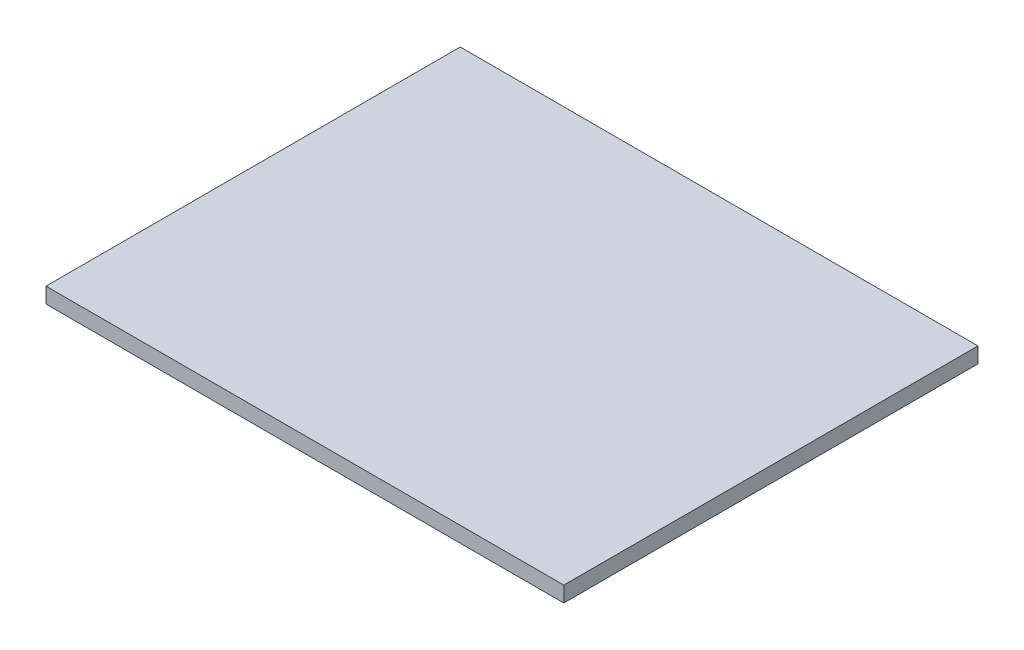
ISO-10303-21;
HEADER;
FILE_DESCRIPTION(('STEP AP214'),'2;1');
FILE_NAME('part.step','',(''),(''),'','','');
FILE_SCHEMA(('AUTOMOTIVE_DESIGN { 1 0 10303 214 1 1 1 1 }'));
ENDSEC;
DATA;
#1=APPLICATION_CONTEXT('core data for automotive mechanical design processes');
#2=APPLICATION_PROTOCOL_DEFINITION('international standard','automotive_design',2000,#1);
#3=PRODUCT_CONTEXT('',#1,'mechanical');
#4=PRODUCT('Part','Part','',(#3));
#5=PRODUCT_RELATED_PRODUCT_CATEGORY('part','',(#4));
#6=PRODUCT_DEFINITION_FORMATION('','',#4);
#7=PRODUCT_DEFINITION_CONTEXT('part definition',#1,'design');
#8=PRODUCT_DEFINITION('design','',#6,#7);
#9=PRODUCT_DEFINITION_SHAPE('','',#8);
#10=(LENGTH_UNIT() NAMED_UNIT(*) SI_UNIT(.MILLI.,.METRE.));
#11=(NAMED_UNIT(*) PLANE_ANGLE_UNIT() SI_UNIT($,.RADIAN.));
#12=(NAMED_UNIT(*) SI_UNIT($,.STERADIAN.) SOLID_ANGLE_UNIT());
#13=UNCERTAINTY_MEASURE_WITH_UNIT(LENGTH_MEASURE(1.E-05),#10,'distance_accuracy_value','');
#14=(GEOMETRIC_REPRESENTATION_CONTEXT(3) GLOBAL_UNCERTAINTY_ASSIGNED_CONTEXT((#13)) GLOBAL_UNIT_ASSIGNED_CONTEXT((#10,
#11,#12)) REPRESENTATION_CONTEXT('',''));
#15=CARTESIAN_POINT('',(0.,0.,0.));
#16=DIRECTION('',(0.,0.,1.));
#17=DIRECTION('',(1.,0.,0.));
#18=AXIS2_PLACEMENT_3D('',#15,#16,#17);
#19=CARTESIAN_POINT('',(0.,3.,0.));
#20=DIRECTION('',(1.,0.,0.));
#21=DIRECTION('',(0.,0.,-1.));
#22=AXIS2_PLACEMENT_3D('',#19,#20,#21);
#23=PLANE('',#22);
#24=DIRECTION('',(0.,0.,1.));
#25=VECTOR('',#24,1.);
#26=CARTESIAN_POINT('',(0.,0.,0.));
#27=LINE('',#26,#25);
#28=CARTESIAN_POINT('',(0.,0.,-80.));
#29=VERTEX_POINT('',#28);
#30=CARTESIAN_POINT('',(0.,0.,0.));
#31=VERTEX_POINT('',#30);
#32=EDGE_CURVE('E97',#29,#31,#27,.T.);
#33=ORIENTED_EDGE('',*,*,#32,.T.);
#34=DIRECTION('',(0.,-1.,0.));
#35=VECTOR('',#34,1.);
#36=CARTESIAN_POINT('',(0.,3.,0.));
#37=LINE('',#36,#35);
#38=CARTESIAN_POINT('',(0.,3.,0.));
#39=VERTEX_POINT('',#38);
#40=EDGE_CURVE('E11',#39,#31,#37,.T.);
#41=ORIENTED_EDGE('',*,*,#40,.F.);
#42=DIRECTION('',(0.,0.,1.));
#43=VECTOR('',#42,1.);
#44=CARTESIAN_POINT('',(0.,3.,0.));
#45=LINE('',#44,#43);
#46=CARTESIAN_POINT('',(0.,3.,-80.));
#47=VERTEX_POINT('',#46);
#48=EDGE_CURVE('E85',#47,#39,#45,.T.);
#49=ORIENTED_EDGE('',*,*,#48,.F.);
#50=DIRECTION('',(0.,-1.,0.));
#51=VECTOR('',#50,1.);
#52=CARTESIAN_POINT('',(0.,3.,-80.));
#53=LINE('',#52,#51);
#54=EDGE_CURVE('E93',#47,#29,#53,.T.);
#55=ORIENTED_EDGE('',*,*,#54,.T.);
#56=EDGE_LOOP('',(#33,#41,#49,#55));
#57=FACE_BOUND('',#56,.T.);
#58=ADVANCED_FACE('F34',(#57),#23,.F.);
#59=CARTESIAN_POINT('',(0.,3.,0.));
#60=DIRECTION('',(0.,0.,-1.));
#61=DIRECTION('',(-1.,0.,0.));
#62=AXIS2_PLACEMENT_3D('',#59,#60,#61);
#63=PLANE('',#62);
#64=DIRECTION('',(1.,0.,0.));
#65=VECTOR('',#64,1.);
#66=CARTESIAN_POINT('',(0.,0.,0.));
#67=LINE('',#66,#65);
#68=CARTESIAN_POINT('',(100.,0.,0.));
#69=VERTEX_POINT('',#68);
#70=EDGE_CURVE('E89',#31,#69,#67,.T.);
#71=ORIENTED_EDGE('',*,*,#70,.T.);
#72=DIRECTION('',(0.,-1.,0.));
#73=VECTOR('',#72,1.);
#74=CARTESIAN_POINT('',(100.,3.,0.));
#75=LINE('',#74,#73);
#76=CARTESIAN_POINT('',(100.,3.,0.));
#77=VERTEX_POINT('',#76);
#78=EDGE_CURVE('E42',#77,#69,#75,.T.);
#79=ORIENTED_EDGE('',*,*,#78,.F.);
#80=DIRECTION('',(1.,0.,0.));
#81=VECTOR('',#80,1.);
#82=CARTESIAN_POINT('',(0.,3.,0.));
#83=LINE('',#82,#81);
#84=EDGE_CURVE('E80',#39,#77,#83,.T.);
#85=ORIENTED_EDGE('',*,*,#84,.F.);
#86=ORIENTED_EDGE('',*,*,#40,.T.);
#87=EDGE_LOOP('',(#71,#79,#85,#86));
#88=FACE_BOUND('',#87,.T.);
#89=ADVANCED_FACE('F88',(#88),#63,.F.);
#90=CARTESIAN_POINT('',(100.,3.,0.));
#91=DIRECTION('',(-1.,0.,0.));
#92=DIRECTION('',(0.,0.,1.));
#93=AXIS2_PLACEMENT_3D('',#90,#91,#92);
#94=PLANE('',#93);
#95=DIRECTION('',(0.,0.,-1.));
#96=VECTOR('',#95,1.);
#97=CARTESIAN_POINT('',(100.,0.,0.));
#98=LINE('',#97,#96);
#99=CARTESIAN_POINT('',(100.,0.,-80.));
#100=VERTEX_POINT('',#99);
#101=EDGE_CURVE('E67',#69,#100,#98,.T.);
#102=ORIENTED_EDGE('',*,*,#101,.T.);
#103=DIRECTION('',(0.,-1.,0.));
#104=VECTOR('',#103,1.);
#105=CARTESIAN_POINT('',(100.,3.,-80.));
#106=LINE('',#105,#104);
#107=CARTESIAN_POINT('',(100.,3.,-80.));
#108=VERTEX_POINT('',#107);
#109=EDGE_CURVE('E90',#108,#100,#106,.T.);
#110=ORIENTED_EDGE('',*,*,#109,.F.);
#111=DIRECTION('',(0.,0.,-1.));
#112=VECTOR('',#111,1.);
#113=CARTESIAN_POINT('',(100.,3.,0.));
#114=LINE('',#113,#112);
#115=EDGE_CURVE('E83',#77,#108,#114,.T.);
#116=ORIENTED_EDGE('',*,*,#115,.F.);
#117=ORIENTED_EDGE('',*,*,#78,.T.);
#118=EDGE_LOOP('',(#102,#110,#116,#117));
#119=FACE_BOUND('',#118,.T.);
#120=ADVANCED_FACE('F91',(#119),#94,.F.);
#121=CARTESIAN_POINT('',(0.,3.,-80.));
#122=DIRECTION('',(0.,0.,1.));
#123=DIRECTION('',(1.,0.,0.));
#124=AXIS2_PLACEMENT_3D('',#121,#122,#123);
#125=PLANE('',#124);
#126=DIRECTION('',(-1.,0.,0.));
#127=VECTOR('',#126,1.);
#128=CARTESIAN_POINT('',(0.,0.,-80.));
#129=LINE('',#128,#127);
#130=EDGE_CURVE('E73',#100,#29,#129,.T.);
#131=ORIENTED_EDGE('',*,*,#130,.T.);
#132=ORIENTED_EDGE('',*,*,#54,.F.);
#133=DIRECTION('',(-1.,0.,0.));
#134=VECTOR('',#133,1.);
#135=CARTESIAN_POINT('',(0.,3.,-80.));
#136=LINE('',#135,#134);
#137=EDGE_CURVE('E50',#108,#47,#136,.T.);
#138=ORIENTED_EDGE('',*,*,#137,.F.);
#139=ORIENTED_EDGE('',*,*,#109,.T.);
#140=EDGE_LOOP('',(#131,#132,#138,#139));
#141=FACE_BOUND('',#140,.T.);
#142=ADVANCED_FACE('F104',(#141),#125,.F.);
#143=CARTESIAN_POINT('',(0.,3.,0.));
#144=DIRECTION('',(0.,-1.,0.));
#145=DIRECTION('',(0.,0.,-1.));
#146=AXIS2_PLACEMENT_3D('',#143,#144,#145);
#147=PLANE('',#146);
#148=ORIENTED_EDGE('',*,*,#48,.T.);
#149=ORIENTED_EDGE('',*,*,#84,.T.);
#150=ORIENTED_EDGE('',*,*,#115,.T.);
#151=ORIENTED_EDGE('',*,*,#137,.T.);
#152=EDGE_LOOP('',(#148,#149,#150,#151));
#153=FACE_BOUND('',#152,.T.);
#154=ADVANCED_FACE('F81',(#153),#147,.F.);
#155=CARTESIAN_POINT('',(0.,0.,0.));
#156=DIRECTION('',(0.,-1.,0.));
#157=DIRECTION('',(0.,0.,-1.));
#158=AXIS2_PLACEMENT_3D('',#155,#156,#157);
#159=PLANE('',#158);
#160=ORIENTED_EDGE('',*,*,#32,.F.);
#161=ORIENTED_EDGE('',*,*,#130,.F.);
#162=ORIENTED_EDGE('',*,*,#101,.F.);
#163=ORIENTED_EDGE('',*,*,#70,.F.);
#164=EDGE_LOOP('',(#160,#161,#162,#163));
#165=FACE_BOUND('',#164,.T.);
#166=ADVANCED_FACE('F107',(#165),#159,.T.);
#167=CLOSED_SHELL('',(#58,#89,#120,#142,#154,#166));
#168=MANIFOLD_SOLID_BREP('B2',#167);
#169=ADVANCED_BREP_SHAPE_REPRESENTATION('',(#18,#168),#14);
#170=SHAPE_DEFINITION_REPRESENTATION(#9,#169);
ENDSEC;
END-ISO-10303-21;
